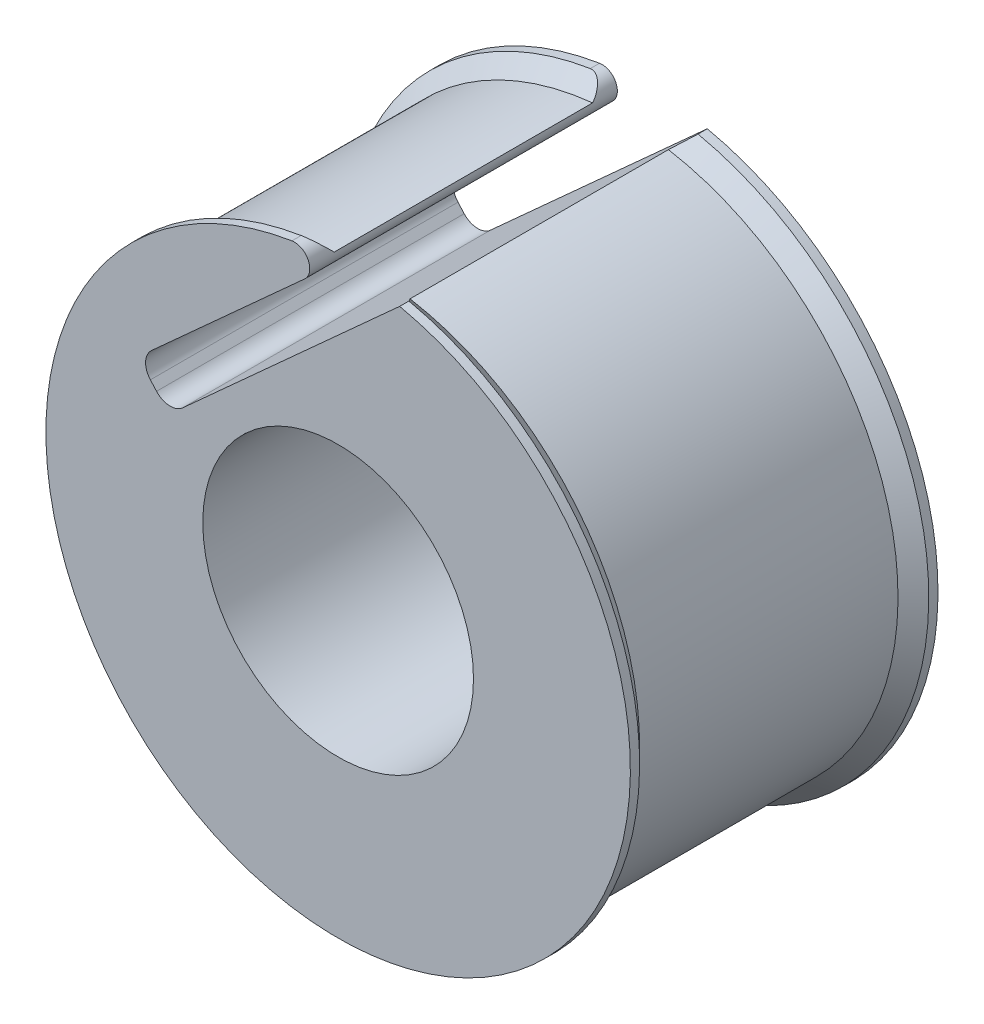
ISO-10303-21;
HEADER;
FILE_DESCRIPTION(('STEP AP214'),'2;1');
FILE_NAME('part.step','',(''),(''),'','','');
FILE_SCHEMA(('AUTOMOTIVE_DESIGN { 1 0 10303 214 1 1 1 1 }'));
ENDSEC;
DATA;
#1=APPLICATION_CONTEXT('core data for automotive mechanical design processes');
#2=APPLICATION_PROTOCOL_DEFINITION('international standard','automotive_design',2000,#1);
#3=PRODUCT_CONTEXT('',#1,'mechanical');
#4=PRODUCT('Part','Part','',(#3));
#5=PRODUCT_RELATED_PRODUCT_CATEGORY('part','',(#4));
#6=PRODUCT_DEFINITION_FORMATION('','',#4);
#7=PRODUCT_DEFINITION_CONTEXT('part definition',#1,'design');
#8=PRODUCT_DEFINITION('design','',#6,#7);
#9=PRODUCT_DEFINITION_SHAPE('','',#8);
#10=(LENGTH_UNIT() NAMED_UNIT(*) SI_UNIT(.MILLI.,.METRE.));
#11=(NAMED_UNIT(*) PLANE_ANGLE_UNIT() SI_UNIT($,.RADIAN.));
#12=(NAMED_UNIT(*) SI_UNIT($,.STERADIAN.) SOLID_ANGLE_UNIT());
#13=UNCERTAINTY_MEASURE_WITH_UNIT(LENGTH_MEASURE(1.E-05),#10,'distance_accuracy_value','');
#14=(GEOMETRIC_REPRESENTATION_CONTEXT(3) GLOBAL_UNCERTAINTY_ASSIGNED_CONTEXT((#13)) GLOBAL_UNIT_ASSIGNED_CONTEXT((#10,
#11,#12)) REPRESENTATION_CONTEXT('',''));
#15=CARTESIAN_POINT('',(0.,0.,0.));
#16=DIRECTION('',(0.,0.,1.));
#17=DIRECTION('',(1.,0.,0.));
#18=AXIS2_PLACEMENT_3D('',#15,#16,#17);
#19=CARTESIAN_POINT('',(0.,0.,5.));
#20=DIRECTION('',(0.,0.,-1.));
#21=DIRECTION('',(-1.,0.,0.));
#22=AXIS2_PLACEMENT_3D('',#19,#20,#21);
#23=CYLINDRICAL_SURFACE('',#22,9.5);
#24=CARTESIAN_POINT('',(0.,0.,-4.70000000000001));
#25=DIRECTION('',(0.,0.,1.));
#26=DIRECTION('',(1.,0.,0.));
#27=AXIS2_PLACEMENT_3D('',#24,#25,#26);
#28=CIRCLE('',#27,9.5);
#29=CARTESIAN_POINT('',(2.00021703970627,9.28704106774966,-4.70000000000001));
#30=VERTEX_POINT('',#29);
#31=CARTESIAN_POINT('',(-1.50183483169937,9.38053794503783,-4.70000000000001));
#32=VERTEX_POINT('',#31);
#33=EDGE_CURVE('E298',#30,#32,#28,.F.);
#34=ORIENTED_EDGE('',*,*,#33,.T.);
#35=DIRECTION('',(0.,0.,-1.));
#36=VECTOR('',#35,1.);
#37=CARTESIAN_POINT('',(-1.50183483169937,9.38053794503783,5.));
#38=LINE('',#37,#36);
#39=CARTESIAN_POINT('',(-1.50183483169937,9.38053794503783,-5.));
#40=VERTEX_POINT('',#39);
#41=EDGE_CURVE('E140',#32,#40,#38,.T.);
#42=ORIENTED_EDGE('',*,*,#41,.T.);
#43=CARTESIAN_POINT('',(0.,0.,-5.));
#44=DIRECTION('',(0.,0.,1.));
#45=DIRECTION('',(1.,0.,0.));
#46=AXIS2_PLACEMENT_3D('',#43,#44,#45);
#47=CIRCLE('',#46,9.5);
#48=CARTESIAN_POINT('',(2.00021703970627,9.28704106774966,-5.));
#49=VERTEX_POINT('',#48);
#50=EDGE_CURVE('E126',#40,#49,#47,.T.);
#51=ORIENTED_EDGE('',*,*,#50,.T.);
#52=DIRECTION('',(0.,0.,1.));
#53=VECTOR('',#52,1.);
#54=CARTESIAN_POINT('',(2.00021703970627,9.28704106774966,-5.));
#55=LINE('',#54,#53);
#56=EDGE_CURVE('E137',#49,#30,#55,.T.);
#57=ORIENTED_EDGE('',*,*,#56,.T.);
#58=EDGE_LOOP('',(#34,#42,#51,#57));
#59=FACE_BOUND('',#58,.T.);
#60=ADVANCED_FACE('F41',(#59),#23,.T.);
#61=CARTESIAN_POINT('',(-5.5,2.5,-5.));
#62=DIRECTION('',(0.670974772387948,-0.741480178304816,0.));
#63=DIRECTION('',(0.741480178304816,0.670974772387948,0.));
#64=AXIS2_PLACEMENT_3D('',#61,#62,#63);
#65=PLANE('',#64);
#66=DIRECTION('',(0.741480178304816,0.670974772387948,0.));
#67=VECTOR('',#66,1.);
#68=CARTESIAN_POINT('',(-5.5,2.5,-5.));
#69=LINE('',#68,#67);
#70=CARTESIAN_POINT('',(-5.05511189301711,2.90258486343277,-5.));
#71=VERTEX_POINT('',#70);
#72=EDGE_CURVE('E122',#71,#49,#69,.T.);
#73=ORIENTED_EDGE('',*,*,#72,.F.);
#74=DIRECTION('',(0.,0.,1.));
#75=VECTOR('',#74,1.);
#76=CARTESIAN_POINT('',(-5.05511189301711,2.90258486343277,5.));
#77=LINE('',#76,#75);
#78=CARTESIAN_POINT('',(-5.05511189301711,2.90258486343277,5.));
#79=VERTEX_POINT('',#78);
#80=EDGE_CURVE('E265',#71,#79,#77,.T.);
#81=ORIENTED_EDGE('',*,*,#80,.T.);
#82=DIRECTION('',(0.741480178304816,0.670974772387948,0.));
#83=VECTOR('',#82,1.);
#84=CARTESIAN_POINT('',(-5.5,2.5,5.));
#85=LINE('',#84,#83);
#86=CARTESIAN_POINT('',(2.00021703970627,9.28704106774966,5.));
#87=VERTEX_POINT('',#86);
#88=EDGE_CURVE('E159',#79,#87,#85,.T.);
#89=ORIENTED_EDGE('',*,*,#88,.T.);
#90=CARTESIAN_POINT('',(2.00021703970627,9.28704106774966,4.70000000000001));
#91=VERTEX_POINT('',#90);
#92=EDGE_CURVE('E131',#91,#87,#55,.T.);
#93=ORIENTED_EDGE('',*,*,#92,.F.);
#94=CARTESIAN_POINT('',(2.00021703970627,9.28704106774966,4.70000000000001));
#95=CARTESIAN_POINT('',(1.92345879784367,9.21758156583768,4.61589556676246));
#96=CARTESIAN_POINT('',(1.84647178052248,9.14791504212559,4.53217669877446));
#97=CARTESIAN_POINT('',(1.69204013773558,9.00816789931547,4.36551003153628));
#98=CARTESIAN_POINT('',(1.61459551193076,8.93808727991057,4.28256223285761));
#99=CARTESIAN_POINT('',(1.53692211032824,8.8677996383987,4.2));
#100=B_SPLINE_CURVE_WITH_KNOTS('',3,(#94,#95,#96,#97,#98,#99),.UNSPECIFIED.,.F.,.F.,(4,2,4),(0.,
0.400129314064835,0.80025892467961),.UNSPECIFIED.);
#101=CARTESIAN_POINT('',(1.53692211032824,8.8677996383987,4.2));
#102=VERTEX_POINT('',#101);
#103=EDGE_CURVE('E178',#91,#102,#100,.T.);
#104=ORIENTED_EDGE('',*,*,#103,.T.);
#105=DIRECTION('',(0.,0.,1.));
#106=VECTOR('',#105,1.);
#107=CARTESIAN_POINT('',(1.53692211032825,8.8677996383987,-4.));
#108=LINE('',#107,#106);
#109=CARTESIAN_POINT('',(1.53692211032824,8.8677996383987,-4.20000000000001));
#110=VERTEX_POINT('',#109);
#111=EDGE_CURVE('E328',#110,#102,#108,.T.);
#112=ORIENTED_EDGE('',*,*,#111,.F.);
#113=CARTESIAN_POINT('',(1.53692211032824,8.8677996383987,-4.20000000000001));
#114=CARTESIAN_POINT('',(1.61459551193076,8.93808727991057,-4.28256223285762));
#115=CARTESIAN_POINT('',(1.69204013773558,9.00816789931547,-4.36551003153628));
#116=CARTESIAN_POINT('',(1.84647178052248,9.14791504212559,-4.53217669877445));
#117=CARTESIAN_POINT('',(1.92345879784367,9.21758156583768,-4.61589556676246));
#118=CARTESIAN_POINT('',(2.00021703970627,9.28704106774966,-4.70000000000001));
#119=B_SPLINE_CURVE_WITH_KNOTS('',3,(#113,#114,#115,#116,#117,#118),.UNSPECIFIED.,.F.,.F.,(4,2,
4),(0.,0.400129610614771,0.800258924679601),.UNSPECIFIED.);
#120=EDGE_CURVE('E148',#110,#30,#119,.T.);
#121=ORIENTED_EDGE('',*,*,#120,.T.);
#122=ORIENTED_EDGE('',*,*,#56,.F.);
#123=EDGE_LOOP('',(#73,#81,#89,#93,#104,#112,#121,#122));
#124=FACE_BOUND('',#123,.T.);
#125=ADVANCED_FACE('F145',(#124),#65,.F.);
#126=CARTESIAN_POINT('',(0.,9.5,-5.));
#127=DIRECTION('',(-0.670974772387948,0.741480178304816,0.));
#128=DIRECTION('',(-0.741480178304816,-0.670974772387948,0.));
#129=AXIS2_PLACEMENT_3D('',#126,#127,#128);
#130=PLANE('',#129);
#131=DIRECTION('',(-0.741480178304816,-0.670974772387948,0.));
#132=VECTOR('',#131,1.);
#133=CARTESIAN_POINT('',(0.,9.5,5.));
#134=LINE('',#133,#132);
#135=CARTESIAN_POINT('',(-1.0873035069949,8.51608533246238,5.));
#136=VERTEX_POINT('',#135);
#137=CARTESIAN_POINT('',(-6.06157405159903,4.01480513088999,5.));
#138=VERTEX_POINT('',#137);
#139=EDGE_CURVE('E283',#136,#138,#134,.T.);
#140=ORIENTED_EDGE('',*,*,#139,.T.);
#141=DIRECTION('',(0.,0.,1.));
#142=VECTOR('',#141,1.);
#143=CARTESIAN_POINT('',(-6.06157405159903,4.01480513088999,-5.));
#144=LINE('',#143,#142);
#145=CARTESIAN_POINT('',(-6.06157405159903,4.01480513088999,-5.));
#146=VERTEX_POINT('',#145);
#147=EDGE_CURVE('E262',#138,#146,#144,.F.);
#148=ORIENTED_EDGE('',*,*,#147,.T.);
#149=DIRECTION('',(-0.741480178304816,-0.670974772387948,0.));
#150=VECTOR('',#149,1.);
#151=CARTESIAN_POINT('',(0.,9.5,-5.));
#152=LINE('',#151,#150);
#153=CARTESIAN_POINT('',(-1.0873035069949,8.51608533246238,-5.));
#154=VERTEX_POINT('',#153);
#155=EDGE_CURVE('E287',#154,#146,#152,.T.);
#156=ORIENTED_EDGE('',*,*,#155,.F.);
#157=DIRECTION('',(0.,0.,-1.));
#158=VECTOR('',#157,1.);
#159=CARTESIAN_POINT('',(-1.0873035069949,8.51608533246238,-5.));
#160=LINE('',#159,#158);
#161=EDGE_CURVE('E306',#154,#136,#160,.F.);
#162=ORIENTED_EDGE('',*,*,#161,.T.);
#163=EDGE_LOOP('',(#140,#148,#156,#162));
#164=FACE_BOUND('',#163,.T.);
#165=ADVANCED_FACE('F193',(#164),#130,.F.);
#166=CARTESIAN_POINT('',(0.,0.,5.));
#167=DIRECTION('',(0.,0.,1.));
#168=DIRECTION('',(1.,0.,0.));
#169=AXIS2_PLACEMENT_3D('',#166,#167,#168);
#170=PLANE('',#169);
#171=ORIENTED_EDGE('',*,*,#139,.F.);
#172=CARTESIAN_POINT('',(-1.42279089318887,8.88682542161478,5.));
#173=DIRECTION('',(0.,0.,1.));
#174=DIRECTION('',(1.,0.,0.));
#175=AXIS2_PLACEMENT_3D('',#172,#173,#174);
#176=CIRCLE('',#175,0.5);
#177=CARTESIAN_POINT('',(-1.50183483169937,9.38053794503783,5.));
#178=VERTEX_POINT('',#177);
#179=EDGE_CURVE('E289',#136,#178,#176,.T.);
#180=ORIENTED_EDGE('',*,*,#179,.T.);
#181=CARTESIAN_POINT('',(0.,0.,5.));
#182=DIRECTION('',(0.,0.,1.));
#183=DIRECTION('',(1.,0.,0.));
#184=AXIS2_PLACEMENT_3D('',#181,#182,#183);
#185=CIRCLE('',#184,9.5);
#186=EDGE_CURVE('E142',#178,#87,#185,.T.);
#187=ORIENTED_EDGE('',*,*,#186,.T.);
#188=ORIENTED_EDGE('',*,*,#88,.F.);
#189=CARTESIAN_POINT('',(-5.45769675644988,3.34747297041566,5.));
#190=DIRECTION('',(0.,0.,1.));
#191=DIRECTION('',(1.,0.,0.));
#192=AXIS2_PLACEMENT_3D('',#189,#190,#191);
#193=CIRCLE('',#192,0.6);
#194=CARTESIAN_POINT('',(-5.90258486343277,2.94488810698289,5.));
#195=VERTEX_POINT('',#194);
#196=EDGE_CURVE('E50',#79,#195,#193,.F.);
#197=ORIENTED_EDGE('',*,*,#196,.T.);
#198=DIRECTION('',(0.670974772387948,-0.741480178304816,0.));
#199=VECTOR('',#198,1.);
#200=CARTESIAN_POINT('',(-6.50646215858192,3.61222026745722,5.));
#201=LINE('',#200,#199);
#202=CARTESIAN_POINT('',(-6.10387729514915,3.16733216047433,5.));
#203=VERTEX_POINT('',#202);
#204=EDGE_CURVE('E279',#203,#195,#201,.T.);
#205=ORIENTED_EDGE('',*,*,#204,.F.);
#206=CARTESIAN_POINT('',(-5.65898918816626,3.5699170239071,5.));
#207=DIRECTION('',(0.,0.,1.));
#208=DIRECTION('',(1.,0.,0.));
#209=AXIS2_PLACEMENT_3D('',#206,#207,#208);
#210=CIRCLE('',#209,0.6);
#211=EDGE_CURVE('E268',#203,#138,#210,.F.);
#212=ORIENTED_EDGE('',*,*,#211,.T.);
#213=EDGE_LOOP('',(#171,#180,#187,#188,#197,#205,#212));
#214=FACE_BOUND('',#213,.T.);
#215=CARTESIAN_POINT('',(0.,0.,5.));
#216=DIRECTION('',(0.,0.,1.));
#217=DIRECTION('',(1.,0.,0.));
#218=AXIS2_PLACEMENT_3D('',#215,#216,#217);
#219=CIRCLE('',#218,4.4);
#220=CARTESIAN_POINT('',(4.4,0.,5.));
#221=VERTEX_POINT('',#220);
#222=EDGE_CURVE('E143',#221,#221,#219,.T.);
#223=ORIENTED_EDGE('',*,*,#222,.F.);
#224=EDGE_LOOP('',(#223));
#225=FACE_BOUND('',#224,.T.);
#226=ADVANCED_FACE('F203',(#214,#225),#170,.T.);
#227=CARTESIAN_POINT('',(0.,0.,-5.));
#228=DIRECTION('',(0.,0.,1.));
#229=DIRECTION('',(1.,0.,0.));
#230=AXIS2_PLACEMENT_3D('',#227,#228,#229);
#231=PLANE('',#230);
#232=ORIENTED_EDGE('',*,*,#50,.F.);
#233=CARTESIAN_POINT('',(-1.42279089318887,8.88682542161478,-5.));
#234=DIRECTION('',(0.,0.,1.));
#235=DIRECTION('',(1.,0.,0.));
#236=AXIS2_PLACEMENT_3D('',#233,#234,#235);
#237=CIRCLE('',#236,0.5);
#238=EDGE_CURVE('E252',#40,#154,#237,.F.);
#239=ORIENTED_EDGE('',*,*,#238,.T.);
#240=ORIENTED_EDGE('',*,*,#155,.T.);
#241=CARTESIAN_POINT('',(-5.65898918816626,3.5699170239071,-5.));
#242=DIRECTION('',(0.,0.,1.));
#243=DIRECTION('',(1.,0.,0.));
#244=AXIS2_PLACEMENT_3D('',#241,#242,#243);
#245=CIRCLE('',#244,0.6);
#246=CARTESIAN_POINT('',(-6.10387729514915,3.16733216047433,-5.));
#247=VERTEX_POINT('',#246);
#248=EDGE_CURVE('E271',#146,#247,#245,.T.);
#249=ORIENTED_EDGE('',*,*,#248,.T.);
#250=DIRECTION('',(0.670974772387948,-0.741480178304816,0.));
#251=VECTOR('',#250,1.);
#252=CARTESIAN_POINT('',(-6.50646215858192,3.61222026745722,-5.));
#253=LINE('',#252,#251);
#254=CARTESIAN_POINT('',(-5.90258486343277,2.94488810698289,-5.));
#255=VERTEX_POINT('',#254);
#256=EDGE_CURVE('E132',#247,#255,#253,.T.);
#257=ORIENTED_EDGE('',*,*,#256,.T.);
#258=CARTESIAN_POINT('',(-5.45769675644988,3.34747297041566,-5.));
#259=DIRECTION('',(0.,0.,1.));
#260=DIRECTION('',(1.,0.,0.));
#261=AXIS2_PLACEMENT_3D('',#258,#259,#260);
#262=CIRCLE('',#261,0.6);
#263=EDGE_CURVE('E11',#255,#71,#262,.T.);
#264=ORIENTED_EDGE('',*,*,#263,.T.);
#265=ORIENTED_EDGE('',*,*,#72,.T.);
#266=EDGE_LOOP('',(#232,#239,#240,#249,#257,#264,#265));
#267=FACE_BOUND('',#266,.T.);
#268=CARTESIAN_POINT('',(0.,0.,-5.));
#269=DIRECTION('',(0.,0.,1.));
#270=DIRECTION('',(1.,0.,0.));
#271=AXIS2_PLACEMENT_3D('',#268,#269,#270);
#272=CIRCLE('',#271,4.4);
#273=CARTESIAN_POINT('',(4.4,0.,-5.));
#274=VERTEX_POINT('',#273);
#275=EDGE_CURVE('E150',#274,#274,#272,.T.);
#276=ORIENTED_EDGE('',*,*,#275,.T.);
#277=EDGE_LOOP('',(#276));
#278=FACE_BOUND('',#277,.T.);
#279=ADVANCED_FACE('F124',(#267,#278),#231,.F.);
#280=ORIENTED_EDGE('',*,*,#186,.F.);
#281=DIRECTION('',(0.,0.,-1.));
#282=VECTOR('',#281,1.);
#283=CARTESIAN_POINT('',(-1.50183483169936,9.38053794503783,4.85000000000001));
#284=LINE('',#283,#282);
#285=CARTESIAN_POINT('',(-1.50183483169937,9.38053794503783,4.70000000000001));
#286=VERTEX_POINT('',#285);
#287=EDGE_CURVE('E234',#178,#286,#284,.T.);
#288=ORIENTED_EDGE('',*,*,#287,.T.);
#289=CARTESIAN_POINT('',(0.,0.,4.70000000000001));
#290=DIRECTION('',(0.,0.,1.));
#291=DIRECTION('',(1.,0.,0.));
#292=AXIS2_PLACEMENT_3D('',#289,#290,#291);
#293=CIRCLE('',#292,9.5);
#294=EDGE_CURVE('E166',#286,#91,#293,.T.);
#295=ORIENTED_EDGE('',*,*,#294,.T.);
#296=ORIENTED_EDGE('',*,*,#92,.T.);
#297=EDGE_LOOP('',(#280,#288,#295,#296));
#298=FACE_BOUND('',#297,.T.);
#299=ADVANCED_FACE('F207',(#298),#23,.T.);
#300=CARTESIAN_POINT('',(0.,0.,5.));
#301=DIRECTION('',(0.,0.,-1.));
#302=DIRECTION('',(-1.,0.,0.));
#303=AXIS2_PLACEMENT_3D('',#300,#301,#302);
#304=CYLINDRICAL_SURFACE('',#303,4.4);
#305=ORIENTED_EDGE('',*,*,#222,.T.);
#306=EDGE_LOOP('',(#305));
#307=FACE_BOUND('',#306,.T.);
#308=ORIENTED_EDGE('',*,*,#275,.F.);
#309=EDGE_LOOP('',(#308));
#310=FACE_BOUND('',#309,.T.);
#311=ADVANCED_FACE('F199',(#307,#310),#304,.F.);
#312=CARTESIAN_POINT('',(-6.50646215858192,3.61222026745722,-5.));
#313=DIRECTION('',(-0.741480178304816,-0.670974772387948,0.));
#314=DIRECTION('',(0.670974772387948,-0.741480178304816,0.));
#315=AXIS2_PLACEMENT_3D('',#312,#313,#314);
#316=PLANE('',#315);
#317=ORIENTED_EDGE('',*,*,#256,.F.);
#318=DIRECTION('',(0.,0.,1.));
#319=VECTOR('',#318,1.);
#320=CARTESIAN_POINT('',(-6.10387729514915,3.16733216047433,5.));
#321=LINE('',#320,#319);
#322=EDGE_CURVE('E258',#247,#203,#321,.T.);
#323=ORIENTED_EDGE('',*,*,#322,.T.);
#324=ORIENTED_EDGE('',*,*,#204,.T.);
#325=DIRECTION('',(0.,0.,1.));
#326=VECTOR('',#325,1.);
#327=CARTESIAN_POINT('',(-5.90258486343277,2.94488810698289,-5.));
#328=LINE('',#327,#326);
#329=EDGE_CURVE('E255',#195,#255,#328,.F.);
#330=ORIENTED_EDGE('',*,*,#329,.T.);
#331=EDGE_LOOP('',(#317,#323,#324,#330));
#332=FACE_BOUND('',#331,.T.);
#333=ADVANCED_FACE('F195',(#332),#316,.F.);
#334=CARTESIAN_POINT('',(0.,0.,-4.));
#335=DIRECTION('',(0.,0.,1.));
#336=DIRECTION('',(1.,0.,0.));
#337=AXIS2_PLACEMENT_3D('',#334,#335,#336);
#338=CYLINDRICAL_SURFACE('',#337,9.);
#339=CARTESIAN_POINT('',(0.,0.,4.2));
#340=DIRECTION('',(0.,0.,1.));
#341=DIRECTION('',(1.,0.,0.));
#342=AXIS2_PLACEMENT_3D('',#339,#340,#341);
#343=CIRCLE('',#342,9.);
#344=CARTESIAN_POINT('',(-0.927073217074927,8.95212462213202,4.2));
#345=VERTEX_POINT('',#344);
#346=EDGE_CURVE('E296',#102,#345,#343,.F.);
#347=ORIENTED_EDGE('',*,*,#346,.T.);
#348=DIRECTION('',(0.,0.,-1.));
#349=VECTOR('',#348,1.);
#350=CARTESIAN_POINT('',(-0.927073217074927,8.95212462213202,4.2));
#351=LINE('',#350,#349);
#352=CARTESIAN_POINT('',(-0.927073217074927,8.95212462213202,-4.20000000000001));
#353=VERTEX_POINT('',#352);
#354=EDGE_CURVE('E233',#345,#353,#351,.T.);
#355=ORIENTED_EDGE('',*,*,#354,.T.);
#356=CARTESIAN_POINT('',(0.,0.,-4.20000000000001));
#357=DIRECTION('',(0.,0.,-1.));
#358=DIRECTION('',(-1.,0.,0.));
#359=AXIS2_PLACEMENT_3D('',#356,#357,#358);
#360=CIRCLE('',#359,9.);
#361=EDGE_CURVE('E301',#353,#110,#360,.F.);
#362=ORIENTED_EDGE('',*,*,#361,.T.);
#363=ORIENTED_EDGE('',*,*,#111,.T.);
#364=EDGE_LOOP('',(#347,#355,#362,#363));
#365=FACE_BOUND('',#364,.T.);
#366=ADVANCED_FACE('F194',(#365),#338,.T.);
#367=CARTESIAN_POINT('',(0.,0.,4.70000000000001));
#368=DIRECTION('',(0.,0.,1.));
#369=DIRECTION('',(1.,0.,0.));
#370=AXIS2_PLACEMENT_3D('',#367,#368,#369);
#371=CONICAL_SURFACE('',#370,9.5,0.785398163397442);
#372=ORIENTED_EDGE('',*,*,#294,.F.);
#373=CARTESIAN_POINT('',(-1.50183483169937,9.38053794503783,4.70000000000001));
#374=CARTESIAN_POINT('',(-1.47938616620423,9.38416999530082,4.70003436142868));
#375=CARTESIAN_POINT('',(-1.4567319245653,9.38619048188407,4.69853277581351));
#376=CARTESIAN_POINT('',(-1.4118881150418,9.38719504555036,4.6927543000858));
#377=CARTESIAN_POINT('',(-1.38969628006514,9.38620327207483,4.68849969684091));
#378=CARTESIAN_POINT('',(-1.34632455897253,9.38142764338381,4.67751675986151));
#379=CARTESIAN_POINT('',(-1.32514235387686,9.37765055090015,4.67079443754797));
#380=CARTESIAN_POINT('',(-1.28413025192635,9.36767820913539,4.65526309821587));
#381=CARTESIAN_POINT('',(-1.26430326339935,9.36147793995165,4.64644976440485));
#382=CARTESIAN_POINT('',(-1.21911198253888,9.34431792869169,4.62347614543419));
#383=CARTESIAN_POINT('',(-1.19448237734428,9.33244506646147,4.60855327888033));
#384=CARTESIAN_POINT('',(-1.14858382074362,9.30577392965531,4.57636531430137));
#385=CARTESIAN_POINT('',(-1.12732034482764,9.29097097510597,4.55909648330151));
#386=CARTESIAN_POINT('',(-1.08103207229592,9.25340844626406,4.5163094267595));
#387=CARTESIAN_POINT('',(-1.05743882205627,9.22971000565913,4.49007034740596));
#388=CARTESIAN_POINT('',(-1.01613918505057,9.17955878645144,4.43561191178878));
#389=CARTESIAN_POINT('',(-0.998448174796481,9.15309904566755,4.40738761144122));
#390=CARTESIAN_POINT('',(-0.968524375226149,9.0980933678017,4.34949135463752));
#391=CARTESIAN_POINT('',(-0.95635011340689,9.06952863611108,4.31980741769132));
#392=CARTESIAN_POINT('',(-0.93762289306557,9.01143462704101,4.2600816313313));
#393=CARTESIAN_POINT('',(-0.931026895845867,8.9819145936613,4.23004436951518));
#394=CARTESIAN_POINT('',(-0.927073217074927,8.95212462213202,4.2));
#395=B_SPLINE_CURVE_WITH_KNOTS('',3,(#373,#374,#375,#376,#377,#378,#379,#380,#381,#382,#383,
#384,#385,#386,#387,#388,#389,#390,#391,#392,#393,#394),.UNSPECIFIED.,.F.,.F.,(4,2,2,2,2,2,2,2,
2,2,4),(0.,0.0680349133868092,0.135525831089965,0.202853418701914,0.27032122923261,
0.363254915779897,0.456338252445588,0.583171258149783,0.710332154919258,0.838812219020512,
0.966291718408865),.UNSPECIFIED.);
#396=EDGE_CURVE('E225',#286,#345,#395,.T.);
#397=ORIENTED_EDGE('',*,*,#396,.T.);
#398=ORIENTED_EDGE('',*,*,#346,.F.);
#399=ORIENTED_EDGE('',*,*,#103,.F.);
#400=EDGE_LOOP('',(#372,#397,#398,#399));
#401=FACE_BOUND('',#400,.T.);
#402=ADVANCED_FACE('F217',(#401),#371,.T.);
#403=CARTESIAN_POINT('',(0.,0.,-4.));
#404=DIRECTION('',(0.,0.,-1.));
#405=DIRECTION('',(-1.,0.,0.));
#406=AXIS2_PLACEMENT_3D('',#403,#404,#405);
#407=CONICAL_SURFACE('',#406,8.79999999999999,0.785398163397454);
#408=ORIENTED_EDGE('',*,*,#361,.F.);
#409=CARTESIAN_POINT('',(-0.927073217074927,8.95212462213202,-4.20000000000001));
#410=CARTESIAN_POINT('',(-0.929563324958784,8.97097425899118,-4.21900640776855));
#411=CARTESIAN_POINT('',(-0.933115446624927,8.98968753496654,-4.23798542097773));
#412=CARTESIAN_POINT('',(-0.942388394803624,9.02675702076508,-4.27581564564971));
#413=CARTESIAN_POINT('',(-0.948112345546283,9.04511267595986,-4.29466663299067));
#414=CARTESIAN_POINT('',(-0.968706364325856,9.09973340075407,-4.35114380889968));
#415=CARTESIAN_POINT('',(-0.986959098978376,9.13523729588052,-4.3883770844846));
#416=CARTESIAN_POINT('',(-1.02607162055869,9.19249381065795,-4.44957244097017));
#417=CARTESIAN_POINT('',(-1.04454443250942,9.21519736284538,-4.4741900293056));
#418=CARTESIAN_POINT('',(-1.08637730975699,9.25792545665781,-4.5214302651487));
#419=CARTESIAN_POINT('',(-1.10972026631133,9.27795898464543,-4.54405951232475));
#420=CARTESIAN_POINT('',(-1.15507890649908,9.30978784165157,-4.58115377198156));
#421=CARTESIAN_POINT('',(-1.17600097995454,9.32239621535676,-4.59625555449087));
#422=CARTESIAN_POINT('',(-1.22068198752771,9.34483722273442,-4.62420388401772));
#423=CARTESIAN_POINT('',(-1.24443835351113,9.35467234245691,-4.63705244697445));
#424=CARTESIAN_POINT('',(-1.28958621316403,9.36921966658169,-4.65753383645613));
#425=CARTESIAN_POINT('',(-1.31053487932643,9.37455697864716,-4.6656951839102));
#426=CARTESIAN_POINT('',(-1.35368479631006,9.38251025319587,-4.67963768741507));
#427=CARTESIAN_POINT('',(-1.37588330054611,9.38513195482384,-4.68542384746482));
#428=CARTESIAN_POINT('',(-1.41545248981302,9.38706184664522,-4.69316371090119));
#429=CARTESIAN_POINT('',(-1.4326778349629,9.38702302899028,-4.69570833666115));
#430=CARTESIAN_POINT('',(-1.46725655897504,9.38514963277458,-4.69913532912727));
#431=CARTESIAN_POINT('',(-1.48461017547867,9.38330860698344,-4.70001169463978));
#432=CARTESIAN_POINT('',(-1.50183483169937,9.38053794503783,-4.7));
#433=B_SPLINE_CURVE_WITH_KNOTS('',3,(#409,#410,#411,#412,#413,#414,#415,#416,#417,#418,#419,
#420,#421,#422,#423,#424,#425,#426,#427,#428,#429,#430,#431,#432),.UNSPECIFIED.,.F.,.F.,(4,2,2,
2,2,2,2,2,2,2,2,4),(0.,0.080594838152969,0.161306056259047,0.324059001024506,0.438442563847226,
0.552430868239698,0.638294060176303,0.72408003459873,0.793129767453437,0.862033271674762,
0.914104633258465,0.966362958552907),.UNSPECIFIED.);
#434=EDGE_CURVE('E243',#353,#32,#433,.T.);
#435=ORIENTED_EDGE('',*,*,#434,.T.);
#436=ORIENTED_EDGE('',*,*,#33,.F.);
#437=ORIENTED_EDGE('',*,*,#120,.F.);
#438=EDGE_LOOP('',(#408,#435,#436,#437));
#439=FACE_BOUND('',#438,.T.);
#440=ADVANCED_FACE('F186',(#439),#407,.T.);
#441=CARTESIAN_POINT('',(-1.42279089318887,8.88682542161478,5.));
#442=DIRECTION('',(0.,0.,-1.));
#443=DIRECTION('',(-1.,0.,0.));
#444=AXIS2_PLACEMENT_3D('',#441,#442,#443);
#445=CYLINDRICAL_SURFACE('',#444,0.5);
#446=ORIENTED_EDGE('',*,*,#238,.F.);
#447=ORIENTED_EDGE('',*,*,#41,.F.);
#448=ORIENTED_EDGE('',*,*,#434,.F.);
#449=ORIENTED_EDGE('',*,*,#354,.F.);
#450=ORIENTED_EDGE('',*,*,#396,.F.);
#451=ORIENTED_EDGE('',*,*,#287,.F.);
#452=ORIENTED_EDGE('',*,*,#179,.F.);
#453=ORIENTED_EDGE('',*,*,#161,.F.);
#454=EDGE_LOOP('',(#446,#447,#448,#449,#450,#451,#452,#453));
#455=FACE_BOUND('',#454,.T.);
#456=ADVANCED_FACE('F237',(#455),#445,.T.);
#457=CARTESIAN_POINT('',(-5.65898918816626,3.5699170239071,-5.));
#458=DIRECTION('',(0.,0.,-1.));
#459=DIRECTION('',(-1.,0.,0.));
#460=AXIS2_PLACEMENT_3D('',#457,#458,#459);
#461=CYLINDRICAL_SURFACE('',#460,0.6);
#462=ORIENTED_EDGE('',*,*,#248,.F.);
#463=ORIENTED_EDGE('',*,*,#147,.F.);
#464=ORIENTED_EDGE('',*,*,#211,.F.);
#465=ORIENTED_EDGE('',*,*,#322,.F.);
#466=EDGE_LOOP('',(#462,#463,#464,#465));
#467=FACE_BOUND('',#466,.T.);
#468=ADVANCED_FACE('F240',(#467),#461,.F.);
#469=CARTESIAN_POINT('',(-5.45769675644988,3.34747297041566,-5.));
#470=DIRECTION('',(0.,0.,-1.));
#471=DIRECTION('',(-1.,0.,0.));
#472=AXIS2_PLACEMENT_3D('',#469,#470,#471);
#473=CYLINDRICAL_SURFACE('',#472,0.6);
#474=ORIENTED_EDGE('',*,*,#263,.F.);
#475=ORIENTED_EDGE('',*,*,#329,.F.);
#476=ORIENTED_EDGE('',*,*,#196,.F.);
#477=ORIENTED_EDGE('',*,*,#80,.F.);
#478=EDGE_LOOP('',(#474,#475,#476,#477));
#479=FACE_BOUND('',#478,.T.);
#480=ADVANCED_FACE('F43',(#479),#473,.F.);
#481=CLOSED_SHELL('',(#60,#125,#165,#226,#279,#299,#311,#333,#366,#402,#440,#456,#468,#480));
#482=MANIFOLD_SOLID_BREP('B2',#481);
#483=ADVANCED_BREP_SHAPE_REPRESENTATION('',(#18,#482),#14);
#484=SHAPE_DEFINITION_REPRESENTATION(#9,#483);
ENDSEC;
END-ISO-10303-21;
